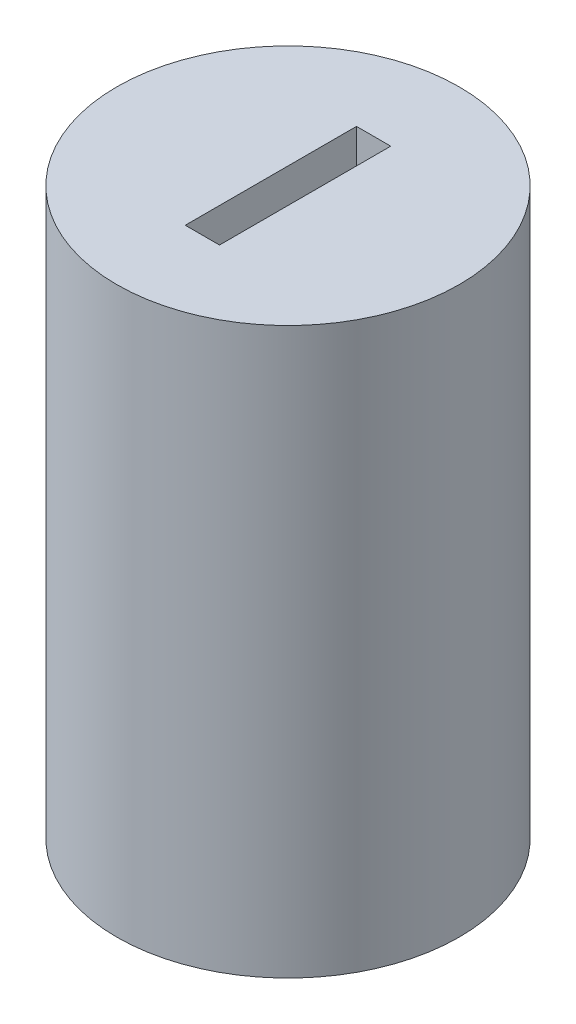
ISO-10303-21;
HEADER;
FILE_DESCRIPTION(('STEP AP214'),'2;1');
FILE_NAME('part.step','',(''),(''),'','','');
FILE_SCHEMA(('AUTOMOTIVE_DESIGN { 1 0 10303 214 1 1 1 1 }'));
ENDSEC;
DATA;
#1=APPLICATION_CONTEXT('core data for automotive mechanical design processes');
#2=APPLICATION_PROTOCOL_DEFINITION('international standard','automotive_design',2000,#1);
#3=PRODUCT_CONTEXT('',#1,'mechanical');
#4=PRODUCT('Part','Part','',(#3));
#5=PRODUCT_RELATED_PRODUCT_CATEGORY('part','',(#4));
#6=PRODUCT_DEFINITION_FORMATION('','',#4);
#7=PRODUCT_DEFINITION_CONTEXT('part definition',#1,'design');
#8=PRODUCT_DEFINITION('design','',#6,#7);
#9=PRODUCT_DEFINITION_SHAPE('','',#8);
#10=(LENGTH_UNIT() NAMED_UNIT(*) SI_UNIT(.MILLI.,.METRE.));
#11=(NAMED_UNIT(*) PLANE_ANGLE_UNIT() SI_UNIT($,.RADIAN.));
#12=(NAMED_UNIT(*) SI_UNIT($,.STERADIAN.) SOLID_ANGLE_UNIT());
#13=UNCERTAINTY_MEASURE_WITH_UNIT(LENGTH_MEASURE(1.E-05),#10,'distance_accuracy_value','');
#14=(GEOMETRIC_REPRESENTATION_CONTEXT(3) GLOBAL_UNCERTAINTY_ASSIGNED_CONTEXT((#13)) GLOBAL_UNIT_ASSIGNED_CONTEXT((#10,
#11,#12)) REPRESENTATION_CONTEXT('',''));
#15=CARTESIAN_POINT('',(0.,0.,0.));
#16=DIRECTION('',(0.,0.,1.));
#17=DIRECTION('',(1.,0.,0.));
#18=AXIS2_PLACEMENT_3D('',#15,#16,#17);
#19=CARTESIAN_POINT('',(0.,0.5,0.));
#20=DIRECTION('',(0.,1.,0.));
#21=DIRECTION('',(0.,0.,1.));
#22=AXIS2_PLACEMENT_3D('',#19,#20,#21);
#23=PLANE('',#22);
#24=CARTESIAN_POINT('',(0.,0.5,0.));
#25=DIRECTION('',(0.,1.,0.));
#26=DIRECTION('',(0.,0.,1.));
#27=AXIS2_PLACEMENT_3D('',#24,#25,#26);
#28=CIRCLE('',#27,4.75);
#29=CARTESIAN_POINT('',(0.,0.5,4.75));
#30=VERTEX_POINT('',#29);
#31=EDGE_CURVE('E50',#30,#30,#28,.F.);
#32=ORIENTED_EDGE('',*,*,#31,.F.);
#33=EDGE_LOOP('',(#32));
#34=FACE_BOUND('',#33,.T.);
#35=ADVANCED_FACE('F41',(#34),#23,.T.);
#36=CARTESIAN_POINT('',(0.,-12.9350288425444,0.));
#37=DIRECTION('',(0.,1.,0.));
#38=DIRECTION('',(0.,0.,1.));
#39=AXIS2_PLACEMENT_3D('',#36,#37,#38);
#40=CYLINDRICAL_SURFACE('',#39,4.75);
#41=ORIENTED_EDGE('',*,*,#31,.T.);
#42=EDGE_LOOP('',(#41));
#43=FACE_BOUND('',#42,.T.);
#44=CARTESIAN_POINT('',(0.,15.5,0.));
#45=DIRECTION('',(0.,1.,0.));
#46=DIRECTION('',(0.,0.,1.));
#47=AXIS2_PLACEMENT_3D('',#44,#45,#46);
#48=CIRCLE('',#47,4.75);
#49=CARTESIAN_POINT('',(0.,15.5,4.75));
#50=VERTEX_POINT('',#49);
#51=EDGE_CURVE('E135',#50,#50,#48,.T.);
#52=ORIENTED_EDGE('',*,*,#51,.T.);
#53=EDGE_LOOP('',(#52));
#54=FACE_BOUND('',#53,.T.);
#55=ADVANCED_FACE('F142',(#43,#54),#40,.F.);
#56=CARTESIAN_POINT('',(0.,15.5,0.));
#57=DIRECTION('',(0.,1.,0.));
#58=DIRECTION('',(0.,0.,1.));
#59=AXIS2_PLACEMENT_3D('',#56,#57,#58);
#60=PLANE('',#59);
#61=DIRECTION('',(1.,0.,0.));
#62=VECTOR('',#61,1.);
#63=CARTESIAN_POINT('',(-0.5,15.5,2.5));
#64=LINE('',#63,#62);
#65=CARTESIAN_POINT('',(-0.5,15.5,2.5));
#66=VERTEX_POINT('',#65);
#67=CARTESIAN_POINT('',(0.5,15.5,2.5));
#68=VERTEX_POINT('',#67);
#69=EDGE_CURVE('E92',#66,#68,#64,.T.);
#70=ORIENTED_EDGE('',*,*,#69,.T.);
#71=DIRECTION('',(0.,0.,-1.));
#72=VECTOR('',#71,1.);
#73=CARTESIAN_POINT('',(0.5,15.5,-2.5));
#74=LINE('',#73,#72);
#75=CARTESIAN_POINT('',(0.5,15.5,-2.5));
#76=VERTEX_POINT('',#75);
#77=EDGE_CURVE('E85',#68,#76,#74,.T.);
#78=ORIENTED_EDGE('',*,*,#77,.T.);
#79=DIRECTION('',(-1.,0.,0.));
#80=VECTOR('',#79,1.);
#81=CARTESIAN_POINT('',(-0.5,15.5,-2.5));
#82=LINE('',#81,#80);
#83=CARTESIAN_POINT('',(-0.5,15.5,-2.5));
#84=VERTEX_POINT('',#83);
#85=EDGE_CURVE('E95',#76,#84,#82,.T.);
#86=ORIENTED_EDGE('',*,*,#85,.T.);
#87=DIRECTION('',(0.,0.,1.));
#88=VECTOR('',#87,1.);
#89=CARTESIAN_POINT('',(-0.5,15.5,-2.5));
#90=LINE('',#89,#88);
#91=EDGE_CURVE('E57',#84,#66,#90,.T.);
#92=ORIENTED_EDGE('',*,*,#91,.T.);
#93=EDGE_LOOP('',(#70,#78,#86,#92));
#94=FACE_BOUND('',#93,.T.);
#95=ORIENTED_EDGE('',*,*,#51,.F.);
#96=EDGE_LOOP('',(#95));
#97=FACE_BOUND('',#96,.T.);
#98=ADVANCED_FACE('F100',(#94,#97),#60,.F.);
#99=CARTESIAN_POINT('',(0.5,15.5,-2.5));
#100=DIRECTION('',(1.,0.,0.));
#101=DIRECTION('',(0.,0.,-1.));
#102=AXIS2_PLACEMENT_3D('',#99,#100,#101);
#103=PLANE('',#102);
#104=DIRECTION('',(0.,0.,-1.));
#105=VECTOR('',#104,1.);
#106=CARTESIAN_POINT('',(0.5,16.5,-2.5));
#107=LINE('',#106,#105);
#108=CARTESIAN_POINT('',(0.5,16.5,2.5));
#109=VERTEX_POINT('',#108);
#110=CARTESIAN_POINT('',(0.5,16.5,-2.5));
#111=VERTEX_POINT('',#110);
#112=EDGE_CURVE('E65',#109,#111,#107,.T.);
#113=ORIENTED_EDGE('',*,*,#112,.T.);
#114=DIRECTION('',(0.,1.,0.));
#115=VECTOR('',#114,1.);
#116=CARTESIAN_POINT('',(0.5,15.5,-2.5));
#117=LINE('',#116,#115);
#118=EDGE_CURVE('E81',#76,#111,#117,.T.);
#119=ORIENTED_EDGE('',*,*,#118,.F.);
#120=ORIENTED_EDGE('',*,*,#77,.F.);
#121=DIRECTION('',(0.,1.,0.));
#122=VECTOR('',#121,1.);
#123=CARTESIAN_POINT('',(0.5,15.5,2.5));
#124=LINE('',#123,#122);
#125=EDGE_CURVE('E123',#68,#109,#124,.T.);
#126=ORIENTED_EDGE('',*,*,#125,.T.);
#127=EDGE_LOOP('',(#113,#119,#120,#126));
#128=FACE_BOUND('',#127,.T.);
#129=ADVANCED_FACE('F83',(#128),#103,.F.);
#130=CARTESIAN_POINT('',(-0.5,15.5,2.5));
#131=DIRECTION('',(0.,0.,1.));
#132=DIRECTION('',(1.,0.,0.));
#133=AXIS2_PLACEMENT_3D('',#130,#131,#132);
#134=PLANE('',#133);
#135=DIRECTION('',(1.,0.,0.));
#136=VECTOR('',#135,1.);
#137=CARTESIAN_POINT('',(-0.5,16.5,2.5));
#138=LINE('',#137,#136);
#139=CARTESIAN_POINT('',(-0.5,16.5,2.5));
#140=VERTEX_POINT('',#139);
#141=EDGE_CURVE('E104',#140,#109,#138,.T.);
#142=ORIENTED_EDGE('',*,*,#141,.T.);
#143=ORIENTED_EDGE('',*,*,#125,.F.);
#144=ORIENTED_EDGE('',*,*,#69,.F.);
#145=DIRECTION('',(0.,1.,0.));
#146=VECTOR('',#145,1.);
#147=CARTESIAN_POINT('',(-0.5,15.5,2.5));
#148=LINE('',#147,#146);
#149=EDGE_CURVE('E127',#66,#140,#148,.T.);
#150=ORIENTED_EDGE('',*,*,#149,.T.);
#151=EDGE_LOOP('',(#142,#143,#144,#150));
#152=FACE_BOUND('',#151,.T.);
#153=ADVANCED_FACE('F175',(#152),#134,.F.);
#154=CARTESIAN_POINT('',(-0.5,15.5,-2.5));
#155=DIRECTION('',(-1.,0.,0.));
#156=DIRECTION('',(0.,0.,1.));
#157=AXIS2_PLACEMENT_3D('',#154,#155,#156);
#158=PLANE('',#157);
#159=DIRECTION('',(0.,0.,1.));
#160=VECTOR('',#159,1.);
#161=CARTESIAN_POINT('',(-0.5,16.5,-2.5));
#162=LINE('',#161,#160);
#163=CARTESIAN_POINT('',(-0.5,16.5,-2.5));
#164=VERTEX_POINT('',#163);
#165=EDGE_CURVE('E108',#164,#140,#162,.T.);
#166=ORIENTED_EDGE('',*,*,#165,.T.);
#167=ORIENTED_EDGE('',*,*,#149,.F.);
#168=ORIENTED_EDGE('',*,*,#91,.F.);
#169=DIRECTION('',(0.,1.,0.));
#170=VECTOR('',#169,1.);
#171=CARTESIAN_POINT('',(-0.5,15.5,-2.5));
#172=LINE('',#171,#170);
#173=EDGE_CURVE('E91',#84,#164,#172,.T.);
#174=ORIENTED_EDGE('',*,*,#173,.T.);
#175=EDGE_LOOP('',(#166,#167,#168,#174));
#176=FACE_BOUND('',#175,.T.);
#177=ADVANCED_FACE('F170',(#176),#158,.F.);
#178=CARTESIAN_POINT('',(-0.5,15.5,-2.5));
#179=DIRECTION('',(0.,0.,-1.));
#180=DIRECTION('',(-1.,0.,0.));
#181=AXIS2_PLACEMENT_3D('',#178,#179,#180);
#182=PLANE('',#181);
#183=DIRECTION('',(-1.,0.,0.));
#184=VECTOR('',#183,1.);
#185=CARTESIAN_POINT('',(-0.5,16.5,-2.5));
#186=LINE('',#185,#184);
#187=EDGE_CURVE('E117',#111,#164,#186,.T.);
#188=ORIENTED_EDGE('',*,*,#187,.T.);
#189=ORIENTED_EDGE('',*,*,#173,.F.);
#190=ORIENTED_EDGE('',*,*,#85,.F.);
#191=ORIENTED_EDGE('',*,*,#118,.T.);
#192=EDGE_LOOP('',(#188,#189,#190,#191));
#193=FACE_BOUND('',#192,.T.);
#194=ADVANCED_FACE('F96',(#193),#182,.F.);
#195=CARTESIAN_POINT('',(0.,1.,0.));
#196=DIRECTION('',(0.,-1.,0.));
#197=DIRECTION('',(0.,0.,-1.));
#198=AXIS2_PLACEMENT_3D('',#195,#196,#197);
#199=CYLINDRICAL_SURFACE('',#198,5.);
#200=CARTESIAN_POINT('',(0.,0.,0.));
#201=DIRECTION('',(0.,1.,0.));
#202=DIRECTION('',(0.,0.,1.));
#203=AXIS2_PLACEMENT_3D('',#200,#201,#202);
#204=CIRCLE('',#203,5.);
#205=CARTESIAN_POINT('',(0.,0.,5.));
#206=VERTEX_POINT('',#205);
#207=EDGE_CURVE('E11',#206,#206,#204,.T.);
#208=ORIENTED_EDGE('',*,*,#207,.T.);
#209=EDGE_LOOP('',(#208));
#210=FACE_BOUND('',#209,.T.);
#211=CARTESIAN_POINT('',(0.,16.5,0.));
#212=DIRECTION('',(0.,1.,0.));
#213=DIRECTION('',(0.,0.,1.));
#214=AXIS2_PLACEMENT_3D('',#211,#212,#213);
#215=CIRCLE('',#214,5.);
#216=CARTESIAN_POINT('',(0.,16.5,5.));
#217=VERTEX_POINT('',#216);
#218=EDGE_CURVE('E126',#217,#217,#215,.T.);
#219=ORIENTED_EDGE('',*,*,#218,.F.);
#220=EDGE_LOOP('',(#219));
#221=FACE_BOUND('',#220,.T.);
#222=ADVANCED_FACE('F43',(#210,#221),#199,.T.);
#223=CARTESIAN_POINT('',(0.,0.,0.));
#224=DIRECTION('',(0.,1.,0.));
#225=DIRECTION('',(0.,0.,1.));
#226=AXIS2_PLACEMENT_3D('',#223,#224,#225);
#227=PLANE('',#226);
#228=ORIENTED_EDGE('',*,*,#207,.F.);
#229=EDGE_LOOP('',(#228));
#230=FACE_BOUND('',#229,.T.);
#231=ADVANCED_FACE('F153',(#230),#227,.F.);
#232=CARTESIAN_POINT('',(0.,16.5,0.));
#233=DIRECTION('',(0.,1.,0.));
#234=DIRECTION('',(0.,0.,1.));
#235=AXIS2_PLACEMENT_3D('',#232,#233,#234);
#236=PLANE('',#235);
#237=ORIENTED_EDGE('',*,*,#112,.F.);
#238=ORIENTED_EDGE('',*,*,#141,.F.);
#239=ORIENTED_EDGE('',*,*,#165,.F.);
#240=ORIENTED_EDGE('',*,*,#187,.F.);
#241=EDGE_LOOP('',(#237,#238,#239,#240));
#242=FACE_BOUND('',#241,.T.);
#243=ORIENTED_EDGE('',*,*,#218,.T.);
#244=EDGE_LOOP('',(#243));
#245=FACE_BOUND('',#244,.T.);
#246=ADVANCED_FACE('F155',(#242,#245),#236,.T.);
#247=CLOSED_SHELL('',(#35,#55,#98,#129,#153,#177,#194,#222,#231,#246));
#248=MANIFOLD_SOLID_BREP('B2',#247);
#249=ADVANCED_BREP_SHAPE_REPRESENTATION('',(#18,#248),#14);
#250=SHAPE_DEFINITION_REPRESENTATION(#9,#249);
ENDSEC;
END-ISO-10303-21;
